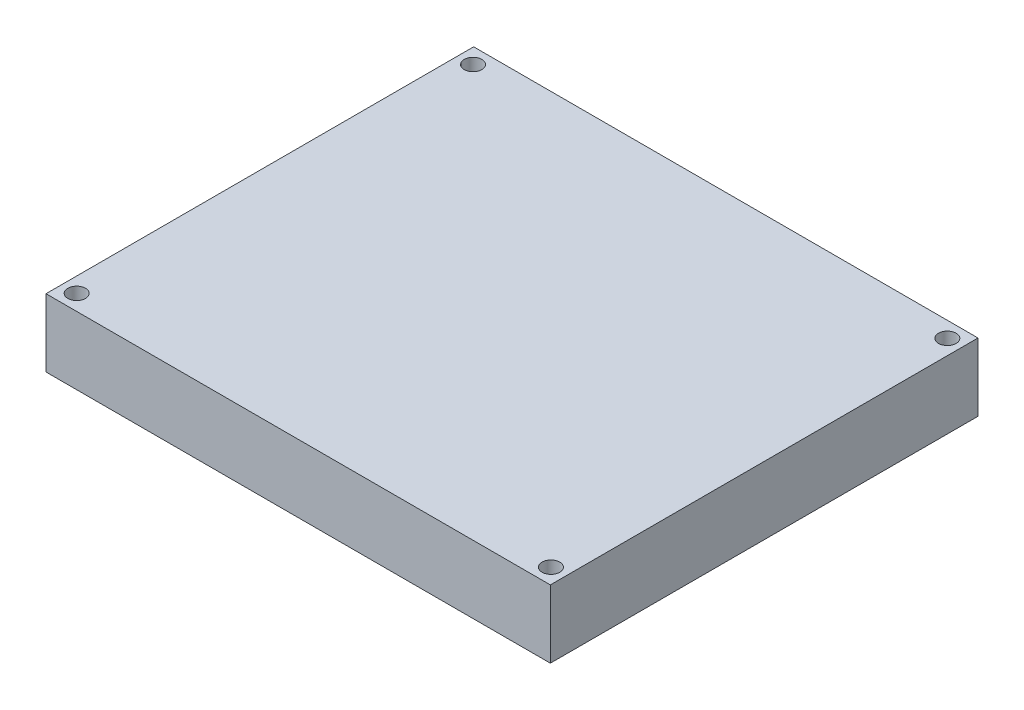
ISO-10303-21;
HEADER;
FILE_DESCRIPTION(('STEP AP214'),'2;1');
FILE_NAME('part.step','',(''),(''),'','','');
FILE_SCHEMA(('AUTOMOTIVE_DESIGN { 1 0 10303 214 1 1 1 1 }'));
ENDSEC;
DATA;
#1=APPLICATION_CONTEXT('core data for automotive mechanical design processes');
#2=APPLICATION_PROTOCOL_DEFINITION('international standard','automotive_design',2000,#1);
#3=PRODUCT_CONTEXT('',#1,'mechanical');
#4=PRODUCT('Part','Part','',(#3));
#5=PRODUCT_RELATED_PRODUCT_CATEGORY('part','',(#4));
#6=PRODUCT_DEFINITION_FORMATION('','',#4);
#7=PRODUCT_DEFINITION_CONTEXT('part definition',#1,'design');
#8=PRODUCT_DEFINITION('design','',#6,#7);
#9=PRODUCT_DEFINITION_SHAPE('','',#8);
#10=(LENGTH_UNIT() NAMED_UNIT(*) SI_UNIT(.MILLI.,.METRE.));
#11=(NAMED_UNIT(*) PLANE_ANGLE_UNIT() SI_UNIT($,.RADIAN.));
#12=(NAMED_UNIT(*) SI_UNIT($,.STERADIAN.) SOLID_ANGLE_UNIT());
#13=UNCERTAINTY_MEASURE_WITH_UNIT(LENGTH_MEASURE(1.E-05),#10,'distance_accuracy_value','');
#14=(GEOMETRIC_REPRESENTATION_CONTEXT(3) GLOBAL_UNCERTAINTY_ASSIGNED_CONTEXT((#13)) GLOBAL_UNIT_ASSIGNED_CONTEXT((#10,
#11,#12)) REPRESENTATION_CONTEXT('',''));
#15=CARTESIAN_POINT('',(0.,0.,0.));
#16=DIRECTION('',(0.,0.,1.));
#17=DIRECTION('',(1.,0.,0.));
#18=AXIS2_PLACEMENT_3D('',#15,#16,#17);
#19=CARTESIAN_POINT('',(0.,11.5,0.));
#20=DIRECTION('',(0.,1.,0.));
#21=DIRECTION('',(0.,0.,1.));
#22=AXIS2_PLACEMENT_3D('',#19,#20,#21);
#23=PLANE('',#22);
#24=CARTESIAN_POINT('',(40.2,11.5,33.6));
#25=DIRECTION('',(0.,1.,0.));
#26=DIRECTION('',(0.,0.,1.));
#27=AXIS2_PLACEMENT_3D('',#24,#25,#26);
#28=CIRCLE('',#27,1.5);
#29=CARTESIAN_POINT('',(40.2,11.5,35.1));
#30=VERTEX_POINT('',#29);
#31=EDGE_CURVE('E177',#30,#30,#28,.T.);
#32=ORIENTED_EDGE('',*,*,#31,.F.);
#33=EDGE_LOOP('',(#32));
#34=FACE_BOUND('',#33,.T.);
#35=CARTESIAN_POINT('',(-40.2,11.5,-33.6));
#36=DIRECTION('',(0.,1.,0.));
#37=DIRECTION('',(0.,0.,1.));
#38=AXIS2_PLACEMENT_3D('',#35,#36,#37);
#39=CIRCLE('',#38,1.5);
#40=CARTESIAN_POINT('',(-40.2,11.5,-32.1));
#41=VERTEX_POINT('',#40);
#42=EDGE_CURVE('E193',#41,#41,#39,.T.);
#43=ORIENTED_EDGE('',*,*,#42,.F.);
#44=EDGE_LOOP('',(#43));
#45=FACE_BOUND('',#44,.T.);
#46=DIRECTION('',(0.,0.,-1.));
#47=VECTOR('',#46,1.);
#48=CARTESIAN_POINT('',(42.75,11.5,-36.25));
#49=LINE('',#48,#47);
#50=CARTESIAN_POINT('',(42.75,11.5,36.25));
#51=VERTEX_POINT('',#50);
#52=CARTESIAN_POINT('',(42.75,11.5,-36.25));
#53=VERTEX_POINT('',#52);
#54=EDGE_CURVE('E201',#51,#53,#49,.T.);
#55=ORIENTED_EDGE('',*,*,#54,.T.);
#56=DIRECTION('',(-1.,0.,0.));
#57=VECTOR('',#56,1.);
#58=CARTESIAN_POINT('',(-42.75,11.5,-36.25));
#59=LINE('',#58,#57);
#60=CARTESIAN_POINT('',(-42.75,11.5,-36.25));
#61=VERTEX_POINT('',#60);
#62=EDGE_CURVE('E96',#53,#61,#59,.T.);
#63=ORIENTED_EDGE('',*,*,#62,.T.);
#64=DIRECTION('',(0.,0.,1.));
#65=VECTOR('',#64,1.);
#66=CARTESIAN_POINT('',(-42.75,11.5,-36.25));
#67=LINE('',#66,#65);
#68=CARTESIAN_POINT('',(-42.75,11.5,36.25));
#69=VERTEX_POINT('',#68);
#70=EDGE_CURVE('E206',#61,#69,#67,.T.);
#71=ORIENTED_EDGE('',*,*,#70,.T.);
#72=DIRECTION('',(1.,0.,0.));
#73=VECTOR('',#72,1.);
#74=CARTESIAN_POINT('',(-42.75,11.5,36.25));
#75=LINE('',#74,#73);
#76=EDGE_CURVE('E68',#69,#51,#75,.T.);
#77=ORIENTED_EDGE('',*,*,#76,.T.);
#78=EDGE_LOOP('',(#55,#63,#71,#77));
#79=FACE_BOUND('',#78,.T.);
#80=CARTESIAN_POINT('',(40.2,11.5,-33.6));
#81=DIRECTION('',(0.,1.,0.));
#82=DIRECTION('',(0.,0.,-1.));
#83=AXIS2_PLACEMENT_3D('',#80,#81,#82);
#84=CIRCLE('',#83,1.5);
#85=CARTESIAN_POINT('',(40.2,11.5,-35.1));
#86=VERTEX_POINT('',#85);
#87=EDGE_CURVE('E185',#86,#86,#84,.T.);
#88=ORIENTED_EDGE('',*,*,#87,.F.);
#89=EDGE_LOOP('',(#88));
#90=FACE_BOUND('',#89,.T.);
#91=CARTESIAN_POINT('',(-40.2,11.5,33.6));
#92=DIRECTION('',(0.,1.,0.));
#93=DIRECTION('',(0.,0.,-1.));
#94=AXIS2_PLACEMENT_3D('',#91,#92,#93);
#95=CIRCLE('',#94,1.5);
#96=CARTESIAN_POINT('',(-40.2,11.5,32.1));
#97=VERTEX_POINT('',#96);
#98=EDGE_CURVE('E169',#97,#97,#95,.T.);
#99=ORIENTED_EDGE('',*,*,#98,.F.);
#100=EDGE_LOOP('',(#99));
#101=FACE_BOUND('',#100,.T.);
#102=ADVANCED_FACE('F43',(#34,#45,#79,#90,#101),#23,.T.);
#103=CARTESIAN_POINT('',(0.,0.,0.));
#104=DIRECTION('',(0.,1.,0.));
#105=DIRECTION('',(0.,0.,1.));
#106=AXIS2_PLACEMENT_3D('',#103,#104,#105);
#107=PLANE('',#106);
#108=DIRECTION('',(0.,0.,-1.));
#109=VECTOR('',#108,1.);
#110=CARTESIAN_POINT('',(42.75,0.,-36.25));
#111=LINE('',#110,#109);
#112=CARTESIAN_POINT('',(42.75,0.,36.25));
#113=VERTEX_POINT('',#112);
#114=CARTESIAN_POINT('',(42.75,0.,-36.25));
#115=VERTEX_POINT('',#114);
#116=EDGE_CURVE('E197',#113,#115,#111,.T.);
#117=ORIENTED_EDGE('',*,*,#116,.F.);
#118=DIRECTION('',(1.,0.,0.));
#119=VECTOR('',#118,1.);
#120=CARTESIAN_POINT('',(-42.75,0.,36.25));
#121=LINE('',#120,#119);
#122=CARTESIAN_POINT('',(-42.75,0.,36.25));
#123=VERTEX_POINT('',#122);
#124=EDGE_CURVE('E89',#123,#113,#121,.T.);
#125=ORIENTED_EDGE('',*,*,#124,.F.);
#126=DIRECTION('',(0.,0.,1.));
#127=VECTOR('',#126,1.);
#128=CARTESIAN_POINT('',(-42.75,0.,-36.25));
#129=LINE('',#128,#127);
#130=CARTESIAN_POINT('',(-42.75,0.,-36.25));
#131=VERTEX_POINT('',#130);
#132=EDGE_CURVE('E218',#131,#123,#129,.T.);
#133=ORIENTED_EDGE('',*,*,#132,.F.);
#134=DIRECTION('',(-1.,0.,0.));
#135=VECTOR('',#134,1.);
#136=CARTESIAN_POINT('',(-42.75,0.,-36.25));
#137=LINE('',#136,#135);
#138=EDGE_CURVE('E215',#115,#131,#137,.T.);
#139=ORIENTED_EDGE('',*,*,#138,.F.);
#140=EDGE_LOOP('',(#117,#125,#133,#139));
#141=FACE_BOUND('',#140,.T.);
#142=CARTESIAN_POINT('',(-40.2,0.,-33.6));
#143=DIRECTION('',(0.,1.,0.));
#144=DIRECTION('',(0.,0.,1.));
#145=AXIS2_PLACEMENT_3D('',#142,#143,#144);
#146=CIRCLE('',#145,1.5);
#147=CARTESIAN_POINT('',(-40.2,0.,-32.1));
#148=VERTEX_POINT('',#147);
#149=EDGE_CURVE('E189',#148,#148,#146,.T.);
#150=ORIENTED_EDGE('',*,*,#149,.T.);
#151=EDGE_LOOP('',(#150));
#152=FACE_BOUND('',#151,.T.);
#153=CARTESIAN_POINT('',(40.2,0.,-33.6));
#154=DIRECTION('',(0.,1.,0.));
#155=DIRECTION('',(0.,0.,-1.));
#156=AXIS2_PLACEMENT_3D('',#153,#154,#155);
#157=CIRCLE('',#156,1.5);
#158=CARTESIAN_POINT('',(40.2,0.,-35.1));
#159=VERTEX_POINT('',#158);
#160=EDGE_CURVE('E181',#159,#159,#157,.T.);
#161=ORIENTED_EDGE('',*,*,#160,.T.);
#162=EDGE_LOOP('',(#161));
#163=FACE_BOUND('',#162,.T.);
#164=CARTESIAN_POINT('',(40.2,0.,33.6));
#165=DIRECTION('',(0.,1.,0.));
#166=DIRECTION('',(0.,0.,1.));
#167=AXIS2_PLACEMENT_3D('',#164,#165,#166);
#168=CIRCLE('',#167,1.5);
#169=CARTESIAN_POINT('',(40.2,0.,35.1));
#170=VERTEX_POINT('',#169);
#171=EDGE_CURVE('E173',#170,#170,#168,.T.);
#172=ORIENTED_EDGE('',*,*,#171,.T.);
#173=EDGE_LOOP('',(#172));
#174=FACE_BOUND('',#173,.T.);
#175=CARTESIAN_POINT('',(-40.2,0.,33.6));
#176=DIRECTION('',(0.,1.,0.));
#177=DIRECTION('',(0.,0.,-1.));
#178=AXIS2_PLACEMENT_3D('',#175,#176,#177);
#179=CIRCLE('',#178,1.5);
#180=CARTESIAN_POINT('',(-40.2,0.,32.1));
#181=VERTEX_POINT('',#180);
#182=EDGE_CURVE('E163',#181,#181,#179,.T.);
#183=ORIENTED_EDGE('',*,*,#182,.T.);
#184=EDGE_LOOP('',(#183));
#185=FACE_BOUND('',#184,.T.);
#186=ADVANCED_FACE('F236',(#141,#152,#163,#174,#185),#107,.F.);
#187=CARTESIAN_POINT('',(42.75,11.5,-36.25));
#188=DIRECTION('',(-1.,0.,0.));
#189=DIRECTION('',(0.,0.,1.));
#190=AXIS2_PLACEMENT_3D('',#187,#188,#189);
#191=PLANE('',#190);
#192=ORIENTED_EDGE('',*,*,#116,.T.);
#193=DIRECTION('',(0.,-1.,0.));
#194=VECTOR('',#193,1.);
#195=CARTESIAN_POINT('',(42.75,11.5,-36.25));
#196=LINE('',#195,#194);
#197=EDGE_CURVE('E11',#53,#115,#196,.T.);
#198=ORIENTED_EDGE('',*,*,#197,.F.);
#199=ORIENTED_EDGE('',*,*,#54,.F.);
#200=DIRECTION('',(0.,-1.,0.));
#201=VECTOR('',#200,1.);
#202=CARTESIAN_POINT('',(42.75,11.5,36.25));
#203=LINE('',#202,#201);
#204=EDGE_CURVE('E211',#51,#113,#203,.T.);
#205=ORIENTED_EDGE('',*,*,#204,.T.);
#206=EDGE_LOOP('',(#192,#198,#199,#205));
#207=FACE_BOUND('',#206,.T.);
#208=ADVANCED_FACE('F45',(#207),#191,.F.);
#209=CARTESIAN_POINT('',(-42.75,11.5,-36.25));
#210=DIRECTION('',(0.,0.,1.));
#211=DIRECTION('',(1.,0.,0.));
#212=AXIS2_PLACEMENT_3D('',#209,#210,#211);
#213=PLANE('',#212);
#214=ORIENTED_EDGE('',*,*,#138,.T.);
#215=DIRECTION('',(0.,-1.,0.));
#216=VECTOR('',#215,1.);
#217=CARTESIAN_POINT('',(-42.75,11.5,-36.25));
#218=LINE('',#217,#216);
#219=EDGE_CURVE('E52',#61,#131,#218,.T.);
#220=ORIENTED_EDGE('',*,*,#219,.F.);
#221=ORIENTED_EDGE('',*,*,#62,.F.);
#222=ORIENTED_EDGE('',*,*,#197,.T.);
#223=EDGE_LOOP('',(#214,#220,#221,#222));
#224=FACE_BOUND('',#223,.T.);
#225=ADVANCED_FACE('F252',(#224),#213,.F.);
#226=CARTESIAN_POINT('',(-42.75,11.5,-36.25));
#227=DIRECTION('',(1.,0.,0.));
#228=DIRECTION('',(0.,0.,-1.));
#229=AXIS2_PLACEMENT_3D('',#226,#227,#228);
#230=PLANE('',#229);
#231=DIRECTION('',(0.,0.,1.));
#232=VECTOR('',#231,1.);
#233=CARTESIAN_POINT('',(-42.75,1.06398736828194,-13.919114990838));
#234=LINE('',#233,#232);
#235=CARTESIAN_POINT('',(-42.75,1.06398736828194,-13.919114990838));
#236=VERTEX_POINT('',#235);
#237=CARTESIAN_POINT('',(-42.75,1.06398736828194,24.3975498715812));
#238=VERTEX_POINT('',#237);
#239=EDGE_CURVE('E154',#236,#238,#234,.T.);
#240=ORIENTED_EDGE('',*,*,#239,.F.);
#241=DIRECTION('',(0.,-1.,0.));
#242=VECTOR('',#241,1.);
#243=CARTESIAN_POINT('',(-42.75,8.83158337440501,-13.919114990838));
#244=LINE('',#243,#242);
#245=CARTESIAN_POINT('',(-42.75,8.83158337440501,-13.919114990838));
#246=VERTEX_POINT('',#245);
#247=EDGE_CURVE('E59',#246,#236,#244,.T.);
#248=ORIENTED_EDGE('',*,*,#247,.F.);
#249=DIRECTION('',(0.,0.,-1.));
#250=VECTOR('',#249,1.);
#251=CARTESIAN_POINT('',(-42.75,8.83158337440501,-13.919114990838));
#252=LINE('',#251,#250);
#253=CARTESIAN_POINT('',(-42.75,8.83158337440501,24.3975498715812));
#254=VERTEX_POINT('',#253);
#255=EDGE_CURVE('E141',#254,#246,#252,.T.);
#256=ORIENTED_EDGE('',*,*,#255,.F.);
#257=DIRECTION('',(0.,1.,0.));
#258=VECTOR('',#257,1.);
#259=CARTESIAN_POINT('',(-42.75,8.83158337440501,24.3975498715812));
#260=LINE('',#259,#258);
#261=EDGE_CURVE('E145',#238,#254,#260,.T.);
#262=ORIENTED_EDGE('',*,*,#261,.F.);
#263=EDGE_LOOP('',(#240,#248,#256,#262));
#264=FACE_BOUND('',#263,.T.);
#265=ORIENTED_EDGE('',*,*,#132,.T.);
#266=DIRECTION('',(0.,-1.,0.));
#267=VECTOR('',#266,1.);
#268=CARTESIAN_POINT('',(-42.75,11.5,36.25));
#269=LINE('',#268,#267);
#270=EDGE_CURVE('E225',#69,#123,#269,.T.);
#271=ORIENTED_EDGE('',*,*,#270,.F.);
#272=ORIENTED_EDGE('',*,*,#70,.F.);
#273=ORIENTED_EDGE('',*,*,#219,.T.);
#274=EDGE_LOOP('',(#265,#271,#272,#273));
#275=FACE_BOUND('',#274,.T.);
#276=ADVANCED_FACE('F232',(#264,#275),#230,.F.);
#277=CARTESIAN_POINT('',(-42.75,11.5,36.25));
#278=DIRECTION('',(0.,0.,-1.));
#279=DIRECTION('',(-1.,0.,0.));
#280=AXIS2_PLACEMENT_3D('',#277,#278,#279);
#281=PLANE('',#280);
#282=ORIENTED_EDGE('',*,*,#124,.T.);
#283=ORIENTED_EDGE('',*,*,#204,.F.);
#284=ORIENTED_EDGE('',*,*,#76,.F.);
#285=ORIENTED_EDGE('',*,*,#270,.T.);
#286=EDGE_LOOP('',(#282,#283,#284,#285));
#287=FACE_BOUND('',#286,.T.);
#288=ADVANCED_FACE('F241',(#287),#281,.F.);
#289=CARTESIAN_POINT('',(-40.2,11.5,-33.6));
#290=DIRECTION('',(0.,-1.,0.));
#291=DIRECTION('',(0.,0.,-1.));
#292=AXIS2_PLACEMENT_3D('',#289,#290,#291);
#293=CYLINDRICAL_SURFACE('',#292,1.5);
#294=ORIENTED_EDGE('',*,*,#42,.T.);
#295=EDGE_LOOP('',(#294));
#296=FACE_BOUND('',#295,.T.);
#297=ORIENTED_EDGE('',*,*,#149,.F.);
#298=EDGE_LOOP('',(#297));
#299=FACE_BOUND('',#298,.T.);
#300=ADVANCED_FACE('F243',(#296,#299),#293,.F.);
#301=CARTESIAN_POINT('',(40.2,11.5,-33.6));
#302=DIRECTION('',(0.,-1.,0.));
#303=DIRECTION('',(0.,0.,-1.));
#304=AXIS2_PLACEMENT_3D('',#301,#302,#303);
#305=CYLINDRICAL_SURFACE('',#304,1.5);
#306=ORIENTED_EDGE('',*,*,#87,.T.);
#307=EDGE_LOOP('',(#306));
#308=FACE_BOUND('',#307,.T.);
#309=ORIENTED_EDGE('',*,*,#160,.F.);
#310=EDGE_LOOP('',(#309));
#311=FACE_BOUND('',#310,.T.);
#312=ADVANCED_FACE('F249',(#308,#311),#305,.F.);
#313=CARTESIAN_POINT('',(40.2,11.5,33.6));
#314=DIRECTION('',(0.,-1.,0.));
#315=DIRECTION('',(0.,0.,-1.));
#316=AXIS2_PLACEMENT_3D('',#313,#314,#315);
#317=CYLINDRICAL_SURFACE('',#316,1.5);
#318=ORIENTED_EDGE('',*,*,#31,.T.);
#319=EDGE_LOOP('',(#318));
#320=FACE_BOUND('',#319,.T.);
#321=ORIENTED_EDGE('',*,*,#171,.F.);
#322=EDGE_LOOP('',(#321));
#323=FACE_BOUND('',#322,.T.);
#324=ADVANCED_FACE('F267',(#320,#323),#317,.F.);
#325=CARTESIAN_POINT('',(-40.2,11.5,33.6));
#326=DIRECTION('',(0.,-1.,0.));
#327=DIRECTION('',(0.,0.,-1.));
#328=AXIS2_PLACEMENT_3D('',#325,#326,#327);
#329=CYLINDRICAL_SURFACE('',#328,1.5);
#330=ORIENTED_EDGE('',*,*,#98,.T.);
#331=EDGE_LOOP('',(#330));
#332=FACE_BOUND('',#331,.T.);
#333=ORIENTED_EDGE('',*,*,#182,.F.);
#334=EDGE_LOOP('',(#333));
#335=FACE_BOUND('',#334,.T.);
#336=ADVANCED_FACE('F271',(#332,#335),#329,.F.);
#337=CARTESIAN_POINT('',(-39.75,8.83158337440501,-13.919114990838));
#338=DIRECTION('',(0.,0.,-1.));
#339=DIRECTION('',(-1.,0.,0.));
#340=AXIS2_PLACEMENT_3D('',#337,#338,#339);
#341=PLANE('',#340);
#342=ORIENTED_EDGE('',*,*,#247,.T.);
#343=DIRECTION('',(-1.,0.,0.));
#344=VECTOR('',#343,1.);
#345=CARTESIAN_POINT('',(-39.75,1.06398736828194,-13.919114990838));
#346=LINE('',#345,#344);
#347=CARTESIAN_POINT('',(-39.75,1.06398736828194,-13.919114990838));
#348=VERTEX_POINT('',#347);
#349=EDGE_CURVE('E116',#348,#236,#346,.T.);
#350=ORIENTED_EDGE('',*,*,#349,.F.);
#351=DIRECTION('',(0.,-1.,0.));
#352=VECTOR('',#351,1.);
#353=CARTESIAN_POINT('',(-39.75,8.83158337440501,-13.919114990838));
#354=LINE('',#353,#352);
#355=CARTESIAN_POINT('',(-39.75,8.83158337440501,-13.919114990838));
#356=VERTEX_POINT('',#355);
#357=EDGE_CURVE('E120',#356,#348,#354,.T.);
#358=ORIENTED_EDGE('',*,*,#357,.F.);
#359=DIRECTION('',(-1.,0.,0.));
#360=VECTOR('',#359,1.);
#361=CARTESIAN_POINT('',(-39.75,8.83158337440501,-13.919114990838));
#362=LINE('',#361,#360);
#363=EDGE_CURVE('E160',#356,#246,#362,.T.);
#364=ORIENTED_EDGE('',*,*,#363,.T.);
#365=EDGE_LOOP('',(#342,#350,#358,#364));
#366=FACE_BOUND('',#365,.T.);
#367=ADVANCED_FACE('F118',(#366),#341,.F.);
#368=CARTESIAN_POINT('',(-39.75,8.83158337440501,-13.919114990838));
#369=DIRECTION('',(0.,1.,0.));
#370=DIRECTION('',(0.,0.,1.));
#371=AXIS2_PLACEMENT_3D('',#368,#369,#370);
#372=PLANE('',#371);
#373=ORIENTED_EDGE('',*,*,#255,.T.);
#374=ORIENTED_EDGE('',*,*,#363,.F.);
#375=DIRECTION('',(0.,0.,-1.));
#376=VECTOR('',#375,1.);
#377=CARTESIAN_POINT('',(-39.75,8.83158337440501,-13.919114990838));
#378=LINE('',#377,#376);
#379=CARTESIAN_POINT('',(-39.75,8.83158337440501,24.3975498715812));
#380=VERTEX_POINT('',#379);
#381=EDGE_CURVE('E127',#380,#356,#378,.T.);
#382=ORIENTED_EDGE('',*,*,#381,.F.);
#383=DIRECTION('',(-1.,0.,0.));
#384=VECTOR('',#383,1.);
#385=CARTESIAN_POINT('',(-39.75,8.83158337440501,24.3975498715812));
#386=LINE('',#385,#384);
#387=EDGE_CURVE('E164',#380,#254,#386,.T.);
#388=ORIENTED_EDGE('',*,*,#387,.T.);
#389=EDGE_LOOP('',(#373,#374,#382,#388));
#390=FACE_BOUND('',#389,.T.);
#391=ADVANCED_FACE('F278',(#390),#372,.F.);
#392=CARTESIAN_POINT('',(-39.75,8.83158337440501,24.3975498715812));
#393=DIRECTION('',(0.,0.,1.));
#394=DIRECTION('',(1.,0.,0.));
#395=AXIS2_PLACEMENT_3D('',#392,#393,#394);
#396=PLANE('',#395);
#397=ORIENTED_EDGE('',*,*,#261,.T.);
#398=ORIENTED_EDGE('',*,*,#387,.F.);
#399=DIRECTION('',(0.,1.,0.));
#400=VECTOR('',#399,1.);
#401=CARTESIAN_POINT('',(-39.75,8.83158337440501,24.3975498715812));
#402=LINE('',#401,#400);
#403=CARTESIAN_POINT('',(-39.75,1.06398736828194,24.3975498715812));
#404=VERTEX_POINT('',#403);
#405=EDGE_CURVE('E136',#404,#380,#402,.T.);
#406=ORIENTED_EDGE('',*,*,#405,.F.);
#407=DIRECTION('',(-1.,0.,0.));
#408=VECTOR('',#407,1.);
#409=CARTESIAN_POINT('',(-39.75,1.06398736828194,24.3975498715812));
#410=LINE('',#409,#408);
#411=EDGE_CURVE('E126',#404,#238,#410,.T.);
#412=ORIENTED_EDGE('',*,*,#411,.T.);
#413=EDGE_LOOP('',(#397,#398,#406,#412));
#414=FACE_BOUND('',#413,.T.);
#415=ADVANCED_FACE('F281',(#414),#396,.F.);
#416=CARTESIAN_POINT('',(-39.75,1.06398736828194,-13.919114990838));
#417=DIRECTION('',(0.,-1.,0.));
#418=DIRECTION('',(0.,0.,-1.));
#419=AXIS2_PLACEMENT_3D('',#416,#417,#418);
#420=PLANE('',#419);
#421=ORIENTED_EDGE('',*,*,#239,.T.);
#422=ORIENTED_EDGE('',*,*,#411,.F.);
#423=DIRECTION('',(0.,0.,1.));
#424=VECTOR('',#423,1.);
#425=CARTESIAN_POINT('',(-39.75,1.06398736828194,-13.919114990838));
#426=LINE('',#425,#424);
#427=EDGE_CURVE('E130',#348,#404,#426,.T.);
#428=ORIENTED_EDGE('',*,*,#427,.F.);
#429=ORIENTED_EDGE('',*,*,#349,.T.);
#430=EDGE_LOOP('',(#421,#422,#428,#429));
#431=FACE_BOUND('',#430,.T.);
#432=ADVANCED_FACE('F131',(#431),#420,.F.);
#433=CARTESIAN_POINT('',(-39.75,0.,0.));
#434=DIRECTION('',(-1.,0.,0.));
#435=DIRECTION('',(0.,0.,1.));
#436=AXIS2_PLACEMENT_3D('',#433,#434,#435);
#437=PLANE('',#436);
#438=ORIENTED_EDGE('',*,*,#357,.T.);
#439=ORIENTED_EDGE('',*,*,#427,.T.);
#440=ORIENTED_EDGE('',*,*,#405,.T.);
#441=ORIENTED_EDGE('',*,*,#381,.T.);
#442=EDGE_LOOP('',(#438,#439,#440,#441));
#443=FACE_BOUND('',#442,.T.);
#444=ADVANCED_FACE('F138',(#443),#437,.T.);
#445=CLOSED_SHELL('',(#102,#186,#208,#225,#276,#288,#300,#312,#324,#336,#367,#391,#415,#432,#444));
#446=MANIFOLD_SOLID_BREP('B2',#445);
#447=ADVANCED_BREP_SHAPE_REPRESENTATION('',(#18,#446),#14);
#448=SHAPE_DEFINITION_REPRESENTATION(#9,#447);
ENDSEC;
END-ISO-10303-21;
